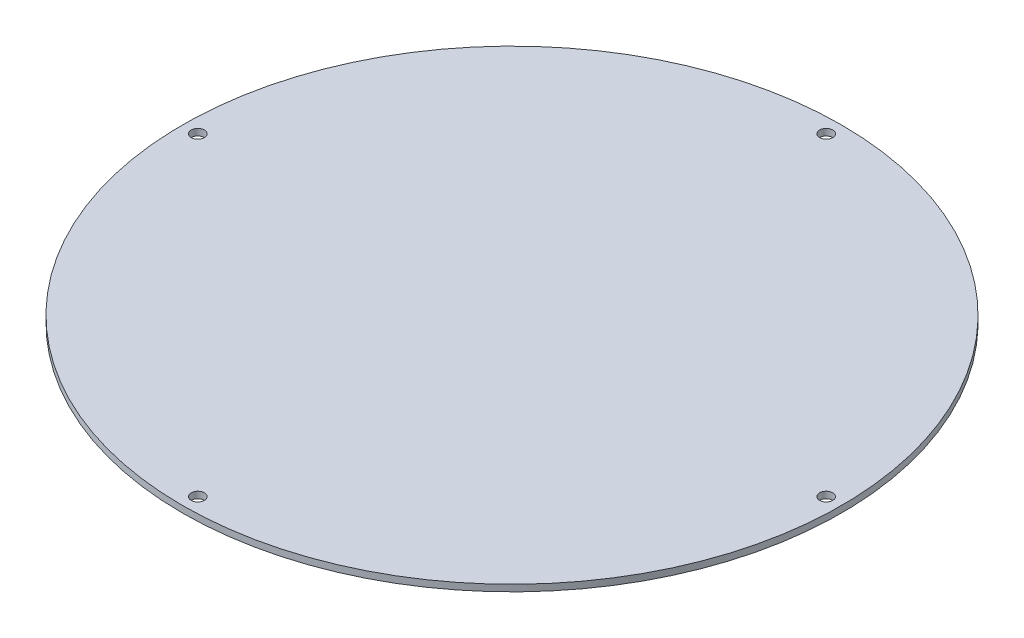
ISO-10303-21;
HEADER;
FILE_DESCRIPTION(('STEP AP214'),'2;1');
FILE_NAME('part.step','',(''),(''),'','','');
FILE_SCHEMA(('AUTOMOTIVE_DESIGN { 1 0 10303 214 1 1 1 1 }'));
ENDSEC;
DATA;
#1=APPLICATION_CONTEXT('core data for automotive mechanical design processes');
#2=APPLICATION_PROTOCOL_DEFINITION('international standard','automotive_design',2000,#1);
#3=PRODUCT_CONTEXT('',#1,'mechanical');
#4=PRODUCT('Part','Part','',(#3));
#5=PRODUCT_RELATED_PRODUCT_CATEGORY('part','',(#4));
#6=PRODUCT_DEFINITION_FORMATION('','',#4);
#7=PRODUCT_DEFINITION_CONTEXT('part definition',#1,'design');
#8=PRODUCT_DEFINITION('design','',#6,#7);
#9=PRODUCT_DEFINITION_SHAPE('','',#8);
#10=(LENGTH_UNIT() NAMED_UNIT(*) SI_UNIT(.MILLI.,.METRE.));
#11=(NAMED_UNIT(*) PLANE_ANGLE_UNIT() SI_UNIT($,.RADIAN.));
#12=(NAMED_UNIT(*) SI_UNIT($,.STERADIAN.) SOLID_ANGLE_UNIT());
#13=UNCERTAINTY_MEASURE_WITH_UNIT(LENGTH_MEASURE(1.E-05),#10,'distance_accuracy_value','');
#14=(GEOMETRIC_REPRESENTATION_CONTEXT(3) GLOBAL_UNCERTAINTY_ASSIGNED_CONTEXT((#13)) GLOBAL_UNIT_ASSIGNED_CONTEXT((#10,
#11,#12)) REPRESENTATION_CONTEXT('',''));
#15=CARTESIAN_POINT('',(0.,0.,0.));
#16=DIRECTION('',(0.,0.,1.));
#17=DIRECTION('',(1.,0.,0.));
#18=AXIS2_PLACEMENT_3D('',#15,#16,#17);
#19=CARTESIAN_POINT('',(0.,1.5,0.));
#20=DIRECTION('',(0.,1.,0.));
#21=DIRECTION('',(0.,0.,1.));
#22=AXIS2_PLACEMENT_3D('',#19,#20,#21);
#23=PLANE('',#22);
#24=CARTESIAN_POINT('',(0.,1.5,71.5));
#25=DIRECTION('',(0.,1.,0.));
#26=DIRECTION('',(0.,0.,1.));
#27=AXIS2_PLACEMENT_3D('',#24,#25,#26);
#28=CIRCLE('',#27,1.5000000000005);
#29=CARTESIAN_POINT('',(0.,1.5,73.0000000000005));
#30=VERTEX_POINT('',#29);
#31=EDGE_CURVE('E52',#30,#30,#28,.T.);
#32=ORIENTED_EDGE('',*,*,#31,.F.);
#33=EDGE_LOOP('',(#32));
#34=FACE_BOUND('',#33,.T.);
#35=CARTESIAN_POINT('',(0.,1.5,-71.5));
#36=DIRECTION('',(0.,1.,0.));
#37=DIRECTION('',(0.,0.,1.));
#38=AXIS2_PLACEMENT_3D('',#35,#36,#37);
#39=CIRCLE('',#38,1.5);
#40=CARTESIAN_POINT('',(0.,1.5,-70.));
#41=VERTEX_POINT('',#40);
#42=EDGE_CURVE('E41',#41,#41,#39,.T.);
#43=ORIENTED_EDGE('',*,*,#42,.F.);
#44=EDGE_LOOP('',(#43));
#45=FACE_BOUND('',#44,.T.);
#46=CARTESIAN_POINT('',(0.,1.5,0.));
#47=DIRECTION('',(0.,1.,0.));
#48=DIRECTION('',(0.,0.,1.));
#49=AXIS2_PLACEMENT_3D('',#46,#47,#48);
#50=CIRCLE('',#49,75.);
#51=CARTESIAN_POINT('',(0.,1.5,75.));
#52=VERTEX_POINT('',#51);
#53=EDGE_CURVE('E10',#52,#52,#50,.T.);
#54=ORIENTED_EDGE('',*,*,#53,.T.);
#55=EDGE_LOOP('',(#54));
#56=FACE_BOUND('',#55,.T.);
#57=CARTESIAN_POINT('',(71.5,1.5,2.49640915727284E-13));
#58=DIRECTION('',(0.,1.,0.));
#59=DIRECTION('',(0.,0.,1.));
#60=AXIS2_PLACEMENT_3D('',#57,#58,#59);
#61=CIRCLE('',#60,1.5);
#62=CARTESIAN_POINT('',(71.5,1.5,1.50000000000025));
#63=VERTEX_POINT('',#62);
#64=EDGE_CURVE('E46',#63,#63,#61,.T.);
#65=ORIENTED_EDGE('',*,*,#64,.F.);
#66=EDGE_LOOP('',(#65));
#67=FACE_BOUND('',#66,.T.);
#68=CARTESIAN_POINT('',(-71.5,1.5,-7.48922747181852E-13));
#69=DIRECTION('',(0.,1.,0.));
#70=DIRECTION('',(0.,0.,1.));
#71=AXIS2_PLACEMENT_3D('',#68,#69,#70);
#72=CIRCLE('',#71,1.5);
#73=CARTESIAN_POINT('',(-71.5,1.5,1.49999999999925));
#74=VERTEX_POINT('',#73);
#75=EDGE_CURVE('E58',#74,#74,#72,.T.);
#76=ORIENTED_EDGE('',*,*,#75,.F.);
#77=EDGE_LOOP('',(#76));
#78=FACE_BOUND('',#77,.T.);
#79=ADVANCED_FACE('F30',(#34,#45,#56,#67,#78),#23,.T.);
#80=CARTESIAN_POINT('',(0.,0.,0.));
#81=DIRECTION('',(0.,1.,0.));
#82=DIRECTION('',(0.,0.,1.));
#83=AXIS2_PLACEMENT_3D('',#80,#81,#82);
#84=PLANE('',#83);
#85=CARTESIAN_POINT('',(0.,0.,0.));
#86=DIRECTION('',(0.,1.,0.));
#87=DIRECTION('',(0.,0.,1.));
#88=AXIS2_PLACEMENT_3D('',#85,#86,#87);
#89=CIRCLE('',#88,75.);
#90=CARTESIAN_POINT('',(0.,0.,75.));
#91=VERTEX_POINT('',#90);
#92=EDGE_CURVE('E34',#91,#91,#89,.T.);
#93=ORIENTED_EDGE('',*,*,#92,.F.);
#94=EDGE_LOOP('',(#93));
#95=FACE_BOUND('',#94,.T.);
#96=CARTESIAN_POINT('',(0.,0.,-71.5));
#97=DIRECTION('',(0.,1.,0.));
#98=DIRECTION('',(0.,0.,1.));
#99=AXIS2_PLACEMENT_3D('',#96,#97,#98);
#100=CIRCLE('',#99,1.5);
#101=CARTESIAN_POINT('',(0.,0.,-70.));
#102=VERTEX_POINT('',#101);
#103=EDGE_CURVE('E43',#102,#102,#100,.T.);
#104=ORIENTED_EDGE('',*,*,#103,.T.);
#105=EDGE_LOOP('',(#104));
#106=FACE_BOUND('',#105,.T.);
#107=CARTESIAN_POINT('',(71.5,0.,2.49640915727284E-13));
#108=DIRECTION('',(0.,1.,0.));
#109=DIRECTION('',(0.,0.,1.));
#110=AXIS2_PLACEMENT_3D('',#107,#108,#109);
#111=CIRCLE('',#110,1.5);
#112=CARTESIAN_POINT('',(71.5,0.,1.50000000000025));
#113=VERTEX_POINT('',#112);
#114=EDGE_CURVE('E49',#113,#113,#111,.T.);
#115=ORIENTED_EDGE('',*,*,#114,.T.);
#116=EDGE_LOOP('',(#115));
#117=FACE_BOUND('',#116,.T.);
#118=CARTESIAN_POINT('',(0.,0.,71.5));
#119=DIRECTION('',(0.,1.,0.));
#120=DIRECTION('',(0.,0.,1.));
#121=AXIS2_PLACEMENT_3D('',#118,#119,#120);
#122=CIRCLE('',#121,1.5000000000005);
#123=CARTESIAN_POINT('',(0.,0.,73.0000000000005));
#124=VERTEX_POINT('',#123);
#125=EDGE_CURVE('E55',#124,#124,#122,.T.);
#126=ORIENTED_EDGE('',*,*,#125,.T.);
#127=EDGE_LOOP('',(#126));
#128=FACE_BOUND('',#127,.T.);
#129=CARTESIAN_POINT('',(-71.5,0.,-7.48922747181852E-13));
#130=DIRECTION('',(0.,1.,0.));
#131=DIRECTION('',(0.,0.,1.));
#132=AXIS2_PLACEMENT_3D('',#129,#130,#131);
#133=CIRCLE('',#132,1.5);
#134=CARTESIAN_POINT('',(-71.5,0.,1.49999999999925));
#135=VERTEX_POINT('',#134);
#136=EDGE_CURVE('E61',#135,#135,#133,.T.);
#137=ORIENTED_EDGE('',*,*,#136,.T.);
#138=EDGE_LOOP('',(#137));
#139=FACE_BOUND('',#138,.T.);
#140=ADVANCED_FACE('F71',(#95,#106,#117,#128,#139),#84,.F.);
#141=CARTESIAN_POINT('',(0.,1.5,0.));
#142=DIRECTION('',(0.,-1.,0.));
#143=DIRECTION('',(0.,0.,-1.));
#144=AXIS2_PLACEMENT_3D('',#141,#142,#143);
#145=CYLINDRICAL_SURFACE('',#144,75.);
#146=ORIENTED_EDGE('',*,*,#53,.F.);
#147=EDGE_LOOP('',(#146));
#148=FACE_BOUND('',#147,.T.);
#149=ORIENTED_EDGE('',*,*,#92,.T.);
#150=EDGE_LOOP('',(#149));
#151=FACE_BOUND('',#150,.T.);
#152=ADVANCED_FACE('F32',(#148,#151),#145,.T.);
#153=CARTESIAN_POINT('',(0.,1.5,-71.5));
#154=DIRECTION('',(0.,-1.,0.));
#155=DIRECTION('',(0.,0.,-1.));
#156=AXIS2_PLACEMENT_3D('',#153,#154,#155);
#157=CYLINDRICAL_SURFACE('',#156,1.5);
#158=ORIENTED_EDGE('',*,*,#42,.T.);
#159=EDGE_LOOP('',(#158));
#160=FACE_BOUND('',#159,.T.);
#161=ORIENTED_EDGE('',*,*,#103,.F.);
#162=EDGE_LOOP('',(#161));
#163=FACE_BOUND('',#162,.T.);
#164=ADVANCED_FACE('F81',(#160,#163),#157,.F.);
#165=CARTESIAN_POINT('',(71.5,1.5,2.49640915727284E-13));
#166=DIRECTION('',(0.,-1.,0.));
#167=DIRECTION('',(0.,0.,-1.));
#168=AXIS2_PLACEMENT_3D('',#165,#166,#167);
#169=CYLINDRICAL_SURFACE('',#168,1.5);
#170=ORIENTED_EDGE('',*,*,#64,.T.);
#171=EDGE_LOOP('',(#170));
#172=FACE_BOUND('',#171,.T.);
#173=ORIENTED_EDGE('',*,*,#114,.F.);
#174=EDGE_LOOP('',(#173));
#175=FACE_BOUND('',#174,.T.);
#176=ADVANCED_FACE('F84',(#172,#175),#169,.F.);
#177=CARTESIAN_POINT('',(0.,1.5,71.5));
#178=DIRECTION('',(0.,-1.,0.));
#179=DIRECTION('',(0.,0.,-1.));
#180=AXIS2_PLACEMENT_3D('',#177,#178,#179);
#181=CYLINDRICAL_SURFACE('',#180,1.5000000000005);
#182=ORIENTED_EDGE('',*,*,#31,.T.);
#183=EDGE_LOOP('',(#182));
#184=FACE_BOUND('',#183,.T.);
#185=ORIENTED_EDGE('',*,*,#125,.F.);
#186=EDGE_LOOP('',(#185));
#187=FACE_BOUND('',#186,.T.);
#188=ADVANCED_FACE('F88',(#184,#187),#181,.F.);
#189=CARTESIAN_POINT('',(-71.5,1.5,-7.48922747181852E-13));
#190=DIRECTION('',(0.,-1.,0.));
#191=DIRECTION('',(0.,0.,-1.));
#192=AXIS2_PLACEMENT_3D('',#189,#190,#191);
#193=CYLINDRICAL_SURFACE('',#192,1.5);
#194=ORIENTED_EDGE('',*,*,#75,.T.);
#195=EDGE_LOOP('',(#194));
#196=FACE_BOUND('',#195,.T.);
#197=ORIENTED_EDGE('',*,*,#136,.F.);
#198=EDGE_LOOP('',(#197));
#199=FACE_BOUND('',#198,.T.);
#200=ADVANCED_FACE('F67',(#196,#199),#193,.F.);
#201=CLOSED_SHELL('',(#79,#140,#152,#164,#176,#188,#200));
#202=MANIFOLD_SOLID_BREP('B2',#201);
#203=ADVANCED_BREP_SHAPE_REPRESENTATION('',(#18,#202),#14);
#204=SHAPE_DEFINITION_REPRESENTATION(#9,#203);
ENDSEC;
END-ISO-10303-21;
